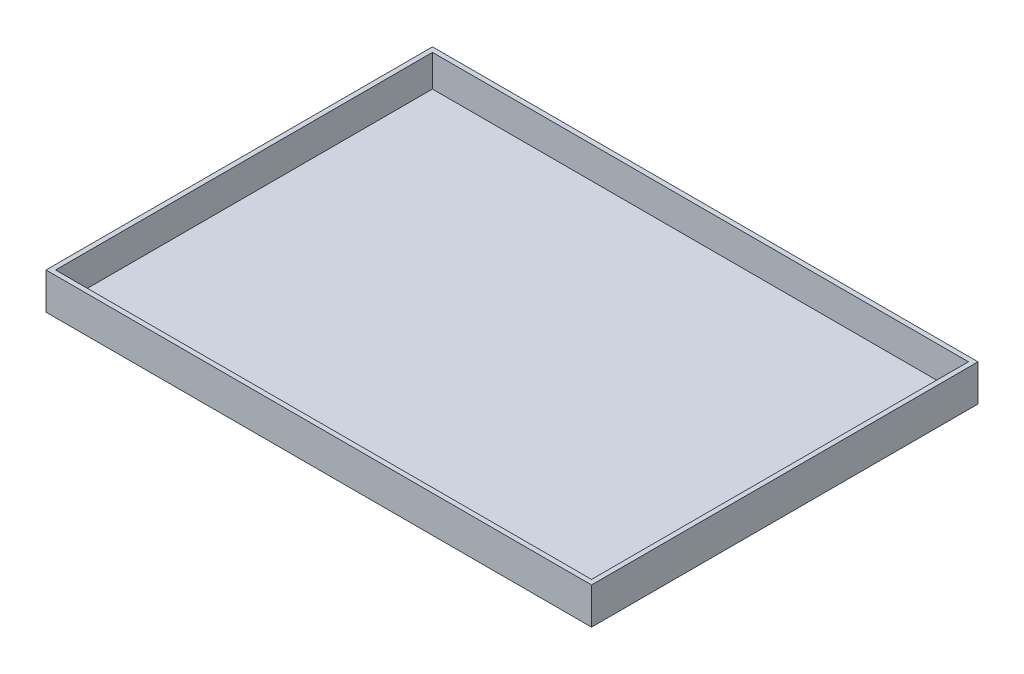
ISO-10303-21;
HEADER;
FILE_DESCRIPTION(('STEP AP214'),'2;1');
FILE_NAME('part.step','',(''),(''),'','','');
FILE_SCHEMA(('AUTOMOTIVE_DESIGN { 1 0 10303 214 1 1 1 1 }'));
ENDSEC;
DATA;
#1=APPLICATION_CONTEXT('core data for automotive mechanical design processes');
#2=APPLICATION_PROTOCOL_DEFINITION('international standard','automotive_design',2000,#1);
#3=PRODUCT_CONTEXT('',#1,'mechanical');
#4=PRODUCT('Part','Part','',(#3));
#5=PRODUCT_RELATED_PRODUCT_CATEGORY('part','',(#4));
#6=PRODUCT_DEFINITION_FORMATION('','',#4);
#7=PRODUCT_DEFINITION_CONTEXT('part definition',#1,'design');
#8=PRODUCT_DEFINITION('design','',#6,#7);
#9=PRODUCT_DEFINITION_SHAPE('','',#8);
#10=(LENGTH_UNIT() NAMED_UNIT(*) SI_UNIT(.MILLI.,.METRE.));
#11=(NAMED_UNIT(*) PLANE_ANGLE_UNIT() SI_UNIT($,.RADIAN.));
#12=(NAMED_UNIT(*) SI_UNIT($,.STERADIAN.) SOLID_ANGLE_UNIT());
#13=UNCERTAINTY_MEASURE_WITH_UNIT(LENGTH_MEASURE(1.E-05),#10,'distance_accuracy_value','');
#14=(GEOMETRIC_REPRESENTATION_CONTEXT(3) GLOBAL_UNCERTAINTY_ASSIGNED_CONTEXT((#13)) GLOBAL_UNIT_ASSIGNED_CONTEXT((#10,
#11,#12)) REPRESENTATION_CONTEXT('',''));
#15=CARTESIAN_POINT('',(0.,0.,0.));
#16=DIRECTION('',(0.,0.,1.));
#17=DIRECTION('',(1.,0.,0.));
#18=AXIS2_PLACEMENT_3D('',#15,#16,#17);
#19=CARTESIAN_POINT('',(-168.5,23.,118.5));
#20=DIRECTION('',(1.,0.,0.));
#21=DIRECTION('',(0.,0.,-1.));
#22=AXIS2_PLACEMENT_3D('',#19,#20,#21);
#23=PLANE('',#22);
#24=DIRECTION('',(0.,-1.,0.));
#25=VECTOR('',#24,1.);
#26=CARTESIAN_POINT('',(-168.5,23.,118.5));
#27=LINE('',#26,#25);
#28=CARTESIAN_POINT('',(-168.5,23.,118.5));
#29=VERTEX_POINT('',#28);
#30=CARTESIAN_POINT('',(-168.5,3.,118.5));
#31=VERTEX_POINT('',#30);
#32=EDGE_CURVE('E105',#29,#31,#27,.T.);
#33=ORIENTED_EDGE('',*,*,#32,.T.);
#34=DIRECTION('',(0.,0.,-1.));
#35=VECTOR('',#34,1.);
#36=CARTESIAN_POINT('',(-168.5,3.,118.5));
#37=LINE('',#36,#35);
#38=CARTESIAN_POINT('',(-168.5,3.,-118.5));
#39=VERTEX_POINT('',#38);
#40=EDGE_CURVE('E96',#31,#39,#37,.T.);
#41=ORIENTED_EDGE('',*,*,#40,.T.);
#42=DIRECTION('',(0.,-1.,0.));
#43=VECTOR('',#42,1.);
#44=CARTESIAN_POINT('',(-168.5,23.,-118.5));
#45=LINE('',#44,#43);
#46=CARTESIAN_POINT('',(-168.5,23.,-118.5));
#47=VERTEX_POINT('',#46);
#48=EDGE_CURVE('E102',#47,#39,#45,.T.);
#49=ORIENTED_EDGE('',*,*,#48,.F.);
#50=DIRECTION('',(0.,0.,1.));
#51=VECTOR('',#50,1.);
#52=CARTESIAN_POINT('',(-168.5,23.,118.5));
#53=LINE('',#52,#51);
#54=EDGE_CURVE('E106',#47,#29,#53,.T.);
#55=ORIENTED_EDGE('',*,*,#54,.T.);
#56=EDGE_LOOP('',(#33,#41,#49,#55));
#57=FACE_BOUND('',#56,.T.);
#58=ADVANCED_FACE('F33',(#57),#23,.T.);
#59=CARTESIAN_POINT('',(168.5,23.,118.5));
#60=DIRECTION('',(0.,0.,-1.));
#61=DIRECTION('',(-1.,0.,0.));
#62=AXIS2_PLACEMENT_3D('',#59,#60,#61);
#63=PLANE('',#62);
#64=DIRECTION('',(0.,-1.,0.));
#65=VECTOR('',#64,1.);
#66=CARTESIAN_POINT('',(168.5,23.,118.5));
#67=LINE('',#66,#65);
#68=CARTESIAN_POINT('',(168.5,23.,118.5));
#69=VERTEX_POINT('',#68);
#70=CARTESIAN_POINT('',(168.5,3.,118.5));
#71=VERTEX_POINT('',#70);
#72=EDGE_CURVE('E113',#69,#71,#67,.T.);
#73=ORIENTED_EDGE('',*,*,#72,.T.);
#74=DIRECTION('',(-1.,0.,0.));
#75=VECTOR('',#74,1.);
#76=CARTESIAN_POINT('',(168.5,3.,118.5));
#77=LINE('',#76,#75);
#78=EDGE_CURVE('E107',#71,#31,#77,.T.);
#79=ORIENTED_EDGE('',*,*,#78,.T.);
#80=ORIENTED_EDGE('',*,*,#32,.F.);
#81=DIRECTION('',(1.,0.,0.));
#82=VECTOR('',#81,1.);
#83=CARTESIAN_POINT('',(168.5,23.,118.5));
#84=LINE('',#83,#82);
#85=EDGE_CURVE('E175',#29,#69,#84,.T.);
#86=ORIENTED_EDGE('',*,*,#85,.T.);
#87=EDGE_LOOP('',(#73,#79,#80,#86));
#88=FACE_BOUND('',#87,.T.);
#89=ADVANCED_FACE('F184',(#88),#63,.T.);
#90=CARTESIAN_POINT('',(168.5,23.,118.5));
#91=DIRECTION('',(-1.,0.,0.));
#92=DIRECTION('',(0.,0.,1.));
#93=AXIS2_PLACEMENT_3D('',#90,#91,#92);
#94=PLANE('',#93);
#95=DIRECTION('',(0.,-1.,0.));
#96=VECTOR('',#95,1.);
#97=CARTESIAN_POINT('',(168.5,23.,-118.5));
#98=LINE('',#97,#96);
#99=CARTESIAN_POINT('',(168.5,23.,-118.5));
#100=VERTEX_POINT('',#99);
#101=CARTESIAN_POINT('',(168.5,3.,-118.5));
#102=VERTEX_POINT('',#101);
#103=EDGE_CURVE('E54',#100,#102,#98,.T.);
#104=ORIENTED_EDGE('',*,*,#103,.T.);
#105=DIRECTION('',(0.,0.,1.));
#106=VECTOR('',#105,1.);
#107=CARTESIAN_POINT('',(168.5,3.,118.5));
#108=LINE('',#107,#106);
#109=EDGE_CURVE('E48',#102,#71,#108,.T.);
#110=ORIENTED_EDGE('',*,*,#109,.T.);
#111=ORIENTED_EDGE('',*,*,#72,.F.);
#112=DIRECTION('',(0.,0.,-1.));
#113=VECTOR('',#112,1.);
#114=CARTESIAN_POINT('',(168.5,23.,118.5));
#115=LINE('',#114,#113);
#116=EDGE_CURVE('E115',#69,#100,#115,.T.);
#117=ORIENTED_EDGE('',*,*,#116,.T.);
#118=EDGE_LOOP('',(#104,#110,#111,#117));
#119=FACE_BOUND('',#118,.T.);
#120=ADVANCED_FACE('F183',(#119),#94,.T.);
#121=CARTESIAN_POINT('',(168.5,23.,-118.5));
#122=DIRECTION('',(0.,0.,1.));
#123=DIRECTION('',(1.,0.,0.));
#124=AXIS2_PLACEMENT_3D('',#121,#122,#123);
#125=PLANE('',#124);
#126=ORIENTED_EDGE('',*,*,#48,.T.);
#127=DIRECTION('',(1.,0.,0.));
#128=VECTOR('',#127,1.);
#129=CARTESIAN_POINT('',(168.5,3.,-118.5));
#130=LINE('',#129,#128);
#131=EDGE_CURVE('E11',#39,#102,#130,.T.);
#132=ORIENTED_EDGE('',*,*,#131,.T.);
#133=ORIENTED_EDGE('',*,*,#103,.F.);
#134=DIRECTION('',(-1.,0.,0.));
#135=VECTOR('',#134,1.);
#136=CARTESIAN_POINT('',(168.5,23.,-118.5));
#137=LINE('',#136,#135);
#138=EDGE_CURVE('E111',#100,#47,#137,.T.);
#139=ORIENTED_EDGE('',*,*,#138,.T.);
#140=EDGE_LOOP('',(#126,#132,#133,#139));
#141=FACE_BOUND('',#140,.T.);
#142=ADVANCED_FACE('F109',(#141),#125,.T.);
#143=CARTESIAN_POINT('',(0.,23.,0.));
#144=DIRECTION('',(0.,1.,0.));
#145=DIRECTION('',(0.,0.,1.));
#146=AXIS2_PLACEMENT_3D('',#143,#144,#145);
#147=PLANE('',#146);
#148=DIRECTION('',(0.,0.,1.));
#149=VECTOR('',#148,1.);
#150=CARTESIAN_POINT('',(-171.5,23.,121.5));
#151=LINE('',#150,#149);
#152=CARTESIAN_POINT('',(-171.5,23.,-121.5));
#153=VERTEX_POINT('',#152);
#154=CARTESIAN_POINT('',(-171.5,23.,121.5));
#155=VERTEX_POINT('',#154);
#156=EDGE_CURVE('E123',#153,#155,#151,.T.);
#157=ORIENTED_EDGE('',*,*,#156,.T.);
#158=DIRECTION('',(1.,0.,0.));
#159=VECTOR('',#158,1.);
#160=CARTESIAN_POINT('',(171.5,23.,121.5));
#161=LINE('',#160,#159);
#162=CARTESIAN_POINT('',(171.5,23.,121.5));
#163=VERTEX_POINT('',#162);
#164=EDGE_CURVE('E126',#155,#163,#161,.T.);
#165=ORIENTED_EDGE('',*,*,#164,.T.);
#166=DIRECTION('',(0.,0.,-1.));
#167=VECTOR('',#166,1.);
#168=CARTESIAN_POINT('',(171.5,23.,121.5));
#169=LINE('',#168,#167);
#170=CARTESIAN_POINT('',(171.5,23.,-121.5));
#171=VERTEX_POINT('',#170);
#172=EDGE_CURVE('E129',#163,#171,#169,.T.);
#173=ORIENTED_EDGE('',*,*,#172,.T.);
#174=DIRECTION('',(-1.,0.,0.));
#175=VECTOR('',#174,1.);
#176=CARTESIAN_POINT('',(171.5,23.,-121.5));
#177=LINE('',#176,#175);
#178=EDGE_CURVE('E131',#171,#153,#177,.T.);
#179=ORIENTED_EDGE('',*,*,#178,.T.);
#180=EDGE_LOOP('',(#157,#165,#173,#179));
#181=FACE_BOUND('',#180,.T.);
#182=ORIENTED_EDGE('',*,*,#85,.F.);
#183=ORIENTED_EDGE('',*,*,#54,.F.);
#184=ORIENTED_EDGE('',*,*,#138,.F.);
#185=ORIENTED_EDGE('',*,*,#116,.F.);
#186=EDGE_LOOP('',(#182,#183,#184,#185));
#187=FACE_BOUND('',#186,.T.);
#188=ADVANCED_FACE('F169',(#181,#187),#147,.T.);
#189=CARTESIAN_POINT('',(0.,0.,0.));
#190=DIRECTION('',(0.,1.,0.));
#191=DIRECTION('',(0.,0.,1.));
#192=AXIS2_PLACEMENT_3D('',#189,#190,#191);
#193=PLANE('',#192);
#194=DIRECTION('',(0.,0.,1.));
#195=VECTOR('',#194,1.);
#196=CARTESIAN_POINT('',(-171.5,0.,121.5));
#197=LINE('',#196,#195);
#198=CARTESIAN_POINT('',(-171.5,0.,-121.5));
#199=VERTEX_POINT('',#198);
#200=CARTESIAN_POINT('',(-171.5,0.,121.5));
#201=VERTEX_POINT('',#200);
#202=EDGE_CURVE('E122',#199,#201,#197,.T.);
#203=ORIENTED_EDGE('',*,*,#202,.F.);
#204=DIRECTION('',(-1.,0.,0.));
#205=VECTOR('',#204,1.);
#206=CARTESIAN_POINT('',(171.5,0.,-121.5));
#207=LINE('',#206,#205);
#208=CARTESIAN_POINT('',(171.5,0.,-121.5));
#209=VERTEX_POINT('',#208);
#210=EDGE_CURVE('E127',#209,#199,#207,.T.);
#211=ORIENTED_EDGE('',*,*,#210,.F.);
#212=DIRECTION('',(0.,0.,-1.));
#213=VECTOR('',#212,1.);
#214=CARTESIAN_POINT('',(171.5,0.,121.5));
#215=LINE('',#214,#213);
#216=CARTESIAN_POINT('',(171.5,0.,121.5));
#217=VERTEX_POINT('',#216);
#218=EDGE_CURVE('E139',#217,#209,#215,.T.);
#219=ORIENTED_EDGE('',*,*,#218,.F.);
#220=DIRECTION('',(1.,0.,0.));
#221=VECTOR('',#220,1.);
#222=CARTESIAN_POINT('',(171.5,0.,121.5));
#223=LINE('',#222,#221);
#224=EDGE_CURVE('E136',#201,#217,#223,.T.);
#225=ORIENTED_EDGE('',*,*,#224,.F.);
#226=EDGE_LOOP('',(#203,#211,#219,#225));
#227=FACE_BOUND('',#226,.T.);
#228=ADVANCED_FACE('F158',(#227),#193,.F.);
#229=CARTESIAN_POINT('',(-171.5,23.,121.5));
#230=DIRECTION('',(1.,0.,0.));
#231=DIRECTION('',(0.,0.,-1.));
#232=AXIS2_PLACEMENT_3D('',#229,#230,#231);
#233=PLANE('',#232);
#234=ORIENTED_EDGE('',*,*,#202,.T.);
#235=DIRECTION('',(0.,-1.,0.));
#236=VECTOR('',#235,1.);
#237=CARTESIAN_POINT('',(-171.5,23.,121.5));
#238=LINE('',#237,#236);
#239=EDGE_CURVE('E41',#155,#201,#238,.T.);
#240=ORIENTED_EDGE('',*,*,#239,.F.);
#241=ORIENTED_EDGE('',*,*,#156,.F.);
#242=DIRECTION('',(0.,-1.,0.));
#243=VECTOR('',#242,1.);
#244=CARTESIAN_POINT('',(-171.5,23.,-121.5));
#245=LINE('',#244,#243);
#246=EDGE_CURVE('E133',#153,#199,#245,.T.);
#247=ORIENTED_EDGE('',*,*,#246,.T.);
#248=EDGE_LOOP('',(#234,#240,#241,#247));
#249=FACE_BOUND('',#248,.T.);
#250=ADVANCED_FACE('F35',(#249),#233,.F.);
#251=CARTESIAN_POINT('',(171.5,23.,121.5));
#252=DIRECTION('',(0.,0.,-1.));
#253=DIRECTION('',(-1.,0.,0.));
#254=AXIS2_PLACEMENT_3D('',#251,#252,#253);
#255=PLANE('',#254);
#256=ORIENTED_EDGE('',*,*,#224,.T.);
#257=DIRECTION('',(0.,-1.,0.));
#258=VECTOR('',#257,1.);
#259=CARTESIAN_POINT('',(171.5,23.,121.5));
#260=LINE('',#259,#258);
#261=EDGE_CURVE('E147',#163,#217,#260,.T.);
#262=ORIENTED_EDGE('',*,*,#261,.F.);
#263=ORIENTED_EDGE('',*,*,#164,.F.);
#264=ORIENTED_EDGE('',*,*,#239,.T.);
#265=EDGE_LOOP('',(#256,#262,#263,#264));
#266=FACE_BOUND('',#265,.T.);
#267=ADVANCED_FACE('F151',(#266),#255,.F.);
#268=CARTESIAN_POINT('',(171.5,23.,121.5));
#269=DIRECTION('',(-1.,0.,0.));
#270=DIRECTION('',(0.,0.,1.));
#271=AXIS2_PLACEMENT_3D('',#268,#269,#270);
#272=PLANE('',#271);
#273=ORIENTED_EDGE('',*,*,#218,.T.);
#274=DIRECTION('',(0.,-1.,0.));
#275=VECTOR('',#274,1.);
#276=CARTESIAN_POINT('',(171.5,23.,-121.5));
#277=LINE('',#276,#275);
#278=EDGE_CURVE('E145',#171,#209,#277,.T.);
#279=ORIENTED_EDGE('',*,*,#278,.F.);
#280=ORIENTED_EDGE('',*,*,#172,.F.);
#281=ORIENTED_EDGE('',*,*,#261,.T.);
#282=EDGE_LOOP('',(#273,#279,#280,#281));
#283=FACE_BOUND('',#282,.T.);
#284=ADVANCED_FACE('F167',(#283),#272,.F.);
#285=CARTESIAN_POINT('',(171.5,23.,-121.5));
#286=DIRECTION('',(0.,0.,1.));
#287=DIRECTION('',(1.,0.,0.));
#288=AXIS2_PLACEMENT_3D('',#285,#286,#287);
#289=PLANE('',#288);
#290=ORIENTED_EDGE('',*,*,#210,.T.);
#291=ORIENTED_EDGE('',*,*,#246,.F.);
#292=ORIENTED_EDGE('',*,*,#178,.F.);
#293=ORIENTED_EDGE('',*,*,#278,.T.);
#294=EDGE_LOOP('',(#290,#291,#292,#293));
#295=FACE_BOUND('',#294,.T.);
#296=ADVANCED_FACE('F163',(#295),#289,.F.);
#297=CARTESIAN_POINT('',(0.,3.,0.));
#298=DIRECTION('',(0.,-1.,0.));
#299=DIRECTION('',(0.,0.,-1.));
#300=AXIS2_PLACEMENT_3D('',#297,#298,#299);
#301=PLANE('',#300);
#302=ORIENTED_EDGE('',*,*,#40,.F.);
#303=ORIENTED_EDGE('',*,*,#78,.F.);
#304=ORIENTED_EDGE('',*,*,#109,.F.);
#305=ORIENTED_EDGE('',*,*,#131,.F.);
#306=EDGE_LOOP('',(#302,#303,#304,#305));
#307=FACE_BOUND('',#306,.T.);
#308=ADVANCED_FACE('F95',(#307),#301,.F.);
#309=CLOSED_SHELL('',(#58,#89,#120,#142,#188,#228,#250,#267,#284,#296,#308));
#310=MANIFOLD_SOLID_BREP('B2',#309);
#311=ADVANCED_BREP_SHAPE_REPRESENTATION('',(#18,#310),#14);
#312=SHAPE_DEFINITION_REPRESENTATION(#9,#311);
ENDSEC;
END-ISO-10303-21;
